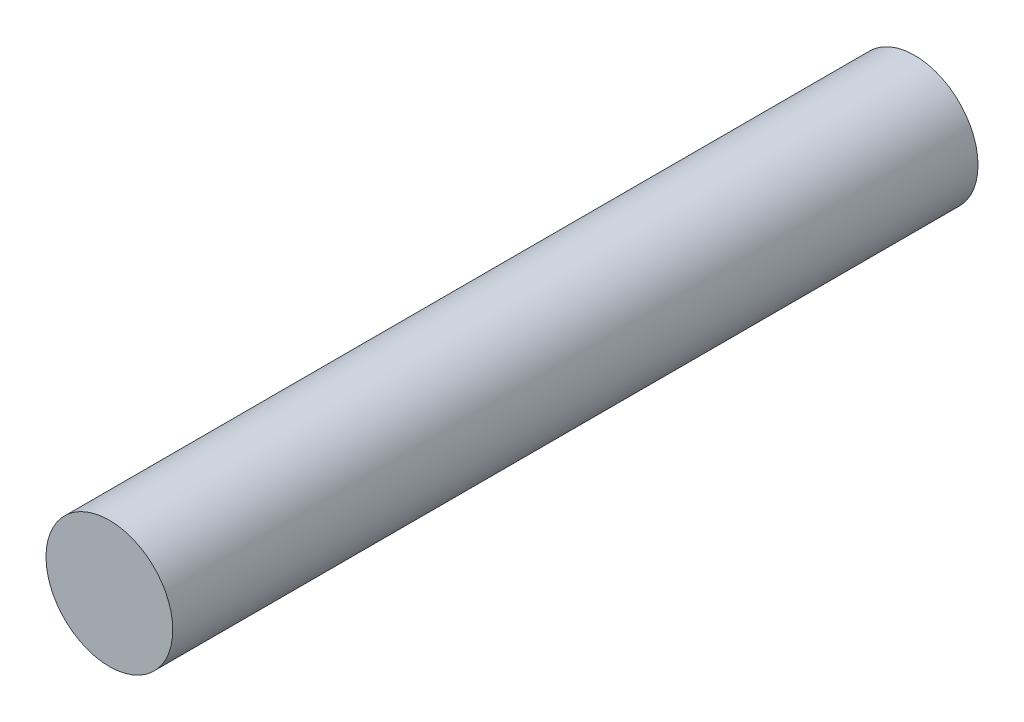
ISO-10303-21;
HEADER;
FILE_DESCRIPTION(('STEP AP214'),'2;1');
FILE_NAME('part.step','',(''),(''),'','','');
FILE_SCHEMA(('AUTOMOTIVE_DESIGN { 1 0 10303 214 1 1 1 1 }'));
ENDSEC;
DATA;
#1=APPLICATION_CONTEXT('core data for automotive mechanical design processes');
#2=APPLICATION_PROTOCOL_DEFINITION('international standard','automotive_design',2000,#1);
#3=PRODUCT_CONTEXT('',#1,'mechanical');
#4=PRODUCT('Part','Part','',(#3));
#5=PRODUCT_RELATED_PRODUCT_CATEGORY('part','',(#4));
#6=PRODUCT_DEFINITION_FORMATION('','',#4);
#7=PRODUCT_DEFINITION_CONTEXT('part definition',#1,'design');
#8=PRODUCT_DEFINITION('design','',#6,#7);
#9=PRODUCT_DEFINITION_SHAPE('','',#8);
#10=(LENGTH_UNIT() NAMED_UNIT(*) SI_UNIT(.MILLI.,.METRE.));
#11=(NAMED_UNIT(*) PLANE_ANGLE_UNIT() SI_UNIT($,.RADIAN.));
#12=(NAMED_UNIT(*) SI_UNIT($,.STERADIAN.) SOLID_ANGLE_UNIT());
#13=UNCERTAINTY_MEASURE_WITH_UNIT(LENGTH_MEASURE(1.E-05),#10,'distance_accuracy_value','');
#14=(GEOMETRIC_REPRESENTATION_CONTEXT(3) GLOBAL_UNCERTAINTY_ASSIGNED_CONTEXT((#13)) GLOBAL_UNIT_ASSIGNED_CONTEXT((#10,
#11,#12)) REPRESENTATION_CONTEXT('',''));
#15=CARTESIAN_POINT('',(0.,0.,0.));
#16=DIRECTION('',(0.,0.,1.));
#17=DIRECTION('',(1.,0.,0.));
#18=AXIS2_PLACEMENT_3D('',#15,#16,#17);
#19=CARTESIAN_POINT('',(0.,0.,13.9754248593737));
#20=DIRECTION('',(0.,0.,1.));
#21=DIRECTION('',(1.,0.,0.));
#22=AXIS2_PLACEMENT_3D('',#19,#20,#21);
#23=PLANE('',#22);
#24=CARTESIAN_POINT('',(0.,0.,13.9754248593737));
#25=DIRECTION('',(0.,0.,-1.));
#26=DIRECTION('',(-1.,0.,0.));
#27=AXIS2_PLACEMENT_3D('',#24,#25,#26);
#28=CIRCLE('',#27,2.2);
#29=CARTESIAN_POINT('',(-2.2,0.,13.9754248593737));
#30=VERTEX_POINT('',#29);
#31=EDGE_CURVE('E9',#30,#30,#28,.T.);
#32=ORIENTED_EDGE('',*,*,#31,.F.);
#33=EDGE_LOOP('',(#32));
#34=FACE_BOUND('',#33,.T.);
#35=ADVANCED_FACE('F14',(#34),#23,.T.);
#36=CARTESIAN_POINT('',(0.,0.,-13.9754248593737));
#37=DIRECTION('',(0.,0.,-1.));
#38=DIRECTION('',(-1.,0.,0.));
#39=AXIS2_PLACEMENT_3D('',#36,#37,#38);
#40=PLANE('',#39);
#41=CARTESIAN_POINT('',(0.,0.,-13.9754248593737));
#42=DIRECTION('',(0.,0.,1.));
#43=DIRECTION('',(1.,0.,0.));
#44=AXIS2_PLACEMENT_3D('',#41,#42,#43);
#45=CIRCLE('',#44,2.2);
#46=CARTESIAN_POINT('',(2.2,0.,-13.9754248593737));
#47=VERTEX_POINT('',#46);
#48=EDGE_CURVE('E21',#47,#47,#45,.T.);
#49=ORIENTED_EDGE('',*,*,#48,.F.);
#50=EDGE_LOOP('',(#49));
#51=FACE_BOUND('',#50,.T.);
#52=ADVANCED_FACE('F29',(#51),#40,.T.);
#53=CARTESIAN_POINT('',(0.,0.,-13.9754248593737));
#54=DIRECTION('',(0.,0.,1.));
#55=DIRECTION('',(1.,0.,0.));
#56=AXIS2_PLACEMENT_3D('',#53,#54,#55);
#57=CYLINDRICAL_SURFACE('',#56,2.2);
#58=ORIENTED_EDGE('',*,*,#31,.T.);
#59=EDGE_LOOP('',(#58));
#60=FACE_BOUND('',#59,.T.);
#61=ORIENTED_EDGE('',*,*,#48,.T.);
#62=EDGE_LOOP('',(#61));
#63=FACE_BOUND('',#62,.T.);
#64=ADVANCED_FACE('F16',(#60,#63),#57,.T.);
#65=CLOSED_SHELL('',(#35,#52,#64));
#66=MANIFOLD_SOLID_BREP('B1',#65);
#67=ADVANCED_BREP_SHAPE_REPRESENTATION('',(#18,#66),#14);
#68=SHAPE_DEFINITION_REPRESENTATION(#9,#67);
ENDSEC;
END-ISO-10303-21;
